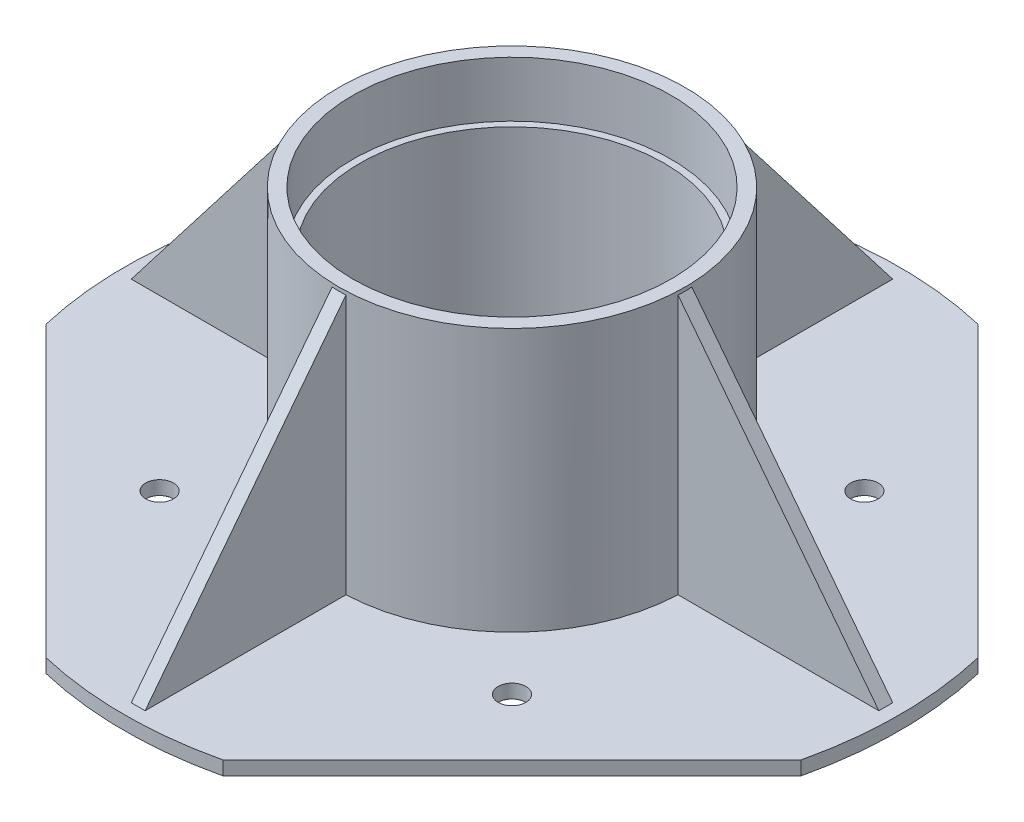
ISO-10303-21;
HEADER;
FILE_DESCRIPTION(('STEP AP214'),'2;1');
FILE_NAME('part.step','',(''),(''),'','','');
FILE_SCHEMA(('AUTOMOTIVE_DESIGN { 1 0 10303 214 1 1 1 1 }'));
ENDSEC;
DATA;
#1=APPLICATION_CONTEXT('core data for automotive mechanical design processes');
#2=APPLICATION_PROTOCOL_DEFINITION('international standard','automotive_design',2000,#1);
#3=PRODUCT_CONTEXT('',#1,'mechanical');
#4=PRODUCT('Part','Part','',(#3));
#5=PRODUCT_RELATED_PRODUCT_CATEGORY('part','',(#4));
#6=PRODUCT_DEFINITION_FORMATION('','',#4);
#7=PRODUCT_DEFINITION_CONTEXT('part definition',#1,'design');
#8=PRODUCT_DEFINITION('design','',#6,#7);
#9=PRODUCT_DEFINITION_SHAPE('','',#8);
#10=(LENGTH_UNIT() NAMED_UNIT(*) SI_UNIT(.MILLI.,.METRE.));
#11=(NAMED_UNIT(*) PLANE_ANGLE_UNIT() SI_UNIT($,.RADIAN.));
#12=(NAMED_UNIT(*) SI_UNIT($,.STERADIAN.) SOLID_ANGLE_UNIT());
#13=UNCERTAINTY_MEASURE_WITH_UNIT(LENGTH_MEASURE(1.E-05),#10,'distance_accuracy_value','');
#14=(GEOMETRIC_REPRESENTATION_CONTEXT(3) GLOBAL_UNCERTAINTY_ASSIGNED_CONTEXT((#13)) GLOBAL_UNIT_ASSIGNED_CONTEXT((#10,
#11,#12)) REPRESENTATION_CONTEXT('',''));
#15=CARTESIAN_POINT('',(0.,0.,0.));
#16=DIRECTION('',(0.,0.,1.));
#17=DIRECTION('',(1.,0.,0.));
#18=AXIS2_PLACEMENT_3D('',#15,#16,#17);
#19=CARTESIAN_POINT('',(0.,0.,0.));
#20=DIRECTION('',(0.,1.,0.));
#21=DIRECTION('',(0.,0.,1.));
#22=AXIS2_PLACEMENT_3D('',#19,#20,#21);
#23=PLANE('',#22);
#24=CARTESIAN_POINT('',(0.,0.,0.));
#25=DIRECTION('',(0.,1.,0.));
#26=DIRECTION('',(0.,0.,1.));
#27=AXIS2_PLACEMENT_3D('',#24,#25,#26);
#28=CIRCLE('',#27,57.5);
#29=CARTESIAN_POINT('',(0.,0.,57.5));
#30=VERTEX_POINT('',#29);
#31=EDGE_CURVE('E602',#30,#30,#28,.T.);
#32=ORIENTED_EDGE('',*,*,#31,.T.);
#33=EDGE_LOOP('',(#32));
#34=FACE_BOUND('',#33,.T.);
#35=DIRECTION('',(0.707106781186547,0.,-0.707106781186549));
#36=VECTOR('',#35,1.);
#37=CARTESIAN_POINT('',(84.1457069611992,0.,84.145706961199));
#38=LINE('',#37,#36);
#39=CARTESIAN_POINT('',(31.9968814710695,0.,136.294532451329));
#40=VERTEX_POINT('',#39);
#41=CARTESIAN_POINT('',(136.294532451329,0.,31.996881471069));
#42=VERTEX_POINT('',#41);
#43=EDGE_CURVE('E326',#40,#42,#38,.T.);
#44=ORIENTED_EDGE('',*,*,#43,.F.);
#45=CARTESIAN_POINT('',(0.,0.,0.));
#46=DIRECTION('',(0.,1.,0.));
#47=DIRECTION('',(0.,0.,1.));
#48=AXIS2_PLACEMENT_3D('',#45,#46,#47);
#49=CIRCLE('',#48,140.);
#50=CARTESIAN_POINT('',(-31.9968814710694,0.,136.294532451329));
#51=VERTEX_POINT('',#50);
#52=EDGE_CURVE('E610',#51,#40,#49,.T.);
#53=ORIENTED_EDGE('',*,*,#52,.F.);
#54=DIRECTION('',(-0.707106781186548,0.,-0.707106781186547));
#55=VECTOR('',#54,1.);
#56=CARTESIAN_POINT('',(-84.1457069611991,0.,84.1457069611992));
#57=LINE('',#56,#55);
#58=CARTESIAN_POINT('',(-136.294532451329,0.,31.9968814710694));
#59=VERTEX_POINT('',#58);
#60=EDGE_CURVE('E343',#51,#59,#57,.T.);
#61=ORIENTED_EDGE('',*,*,#60,.T.);
#62=CARTESIAN_POINT('',(-136.294532451329,0.,-31.9968814710694));
#63=VERTEX_POINT('',#62);
#64=EDGE_CURVE('E614',#63,#59,#49,.T.);
#65=ORIENTED_EDGE('',*,*,#64,.F.);
#66=DIRECTION('',(0.707106781186546,0.,-0.707106781186549));
#67=VECTOR('',#66,1.);
#68=CARTESIAN_POINT('',(-84.1457069611994,0.,-84.1457069611991));
#69=LINE('',#68,#67);
#70=CARTESIAN_POINT('',(-31.9968814710699,0.,-136.294532451329));
#71=VERTEX_POINT('',#70);
#72=EDGE_CURVE('E320',#63,#71,#69,.T.);
#73=ORIENTED_EDGE('',*,*,#72,.T.);
#74=CARTESIAN_POINT('',(31.9968814710675,0.,-136.294532451329));
#75=VERTEX_POINT('',#74);
#76=EDGE_CURVE('E619',#75,#71,#49,.T.);
#77=ORIENTED_EDGE('',*,*,#76,.F.);
#78=DIRECTION('',(-0.707106781186551,0.,-0.707106781186544));
#79=VECTOR('',#78,1.);
#80=CARTESIAN_POINT('',(84.1457069611982,0.,-84.1457069611992));
#81=LINE('',#80,#79);
#82=CARTESIAN_POINT('',(136.294532451329,0.,-31.996881471069));
#83=VERTEX_POINT('',#82);
#84=EDGE_CURVE('E337',#83,#75,#81,.T.);
#85=ORIENTED_EDGE('',*,*,#84,.F.);
#86=EDGE_CURVE('E561',#42,#83,#49,.T.);
#87=ORIENTED_EDGE('',*,*,#86,.F.);
#88=EDGE_LOOP('',(#44,#53,#61,#65,#73,#77,#85,#87));
#89=FACE_BOUND('',#88,.T.);
#90=CARTESIAN_POINT('',(-63.6394619107193,0.,63.6397587025132));
#91=DIRECTION('',(0.,-1.,0.));
#92=DIRECTION('',(0.,0.,-1.));
#93=AXIS2_PLACEMENT_3D('',#90,#91,#92);
#94=CIRCLE('',#93,5.025);
#95=CARTESIAN_POINT('',(-63.6394619107193,0.,58.6147587025132));
#96=VERTEX_POINT('',#95);
#97=EDGE_CURVE('E529',#96,#96,#94,.T.);
#98=ORIENTED_EDGE('',*,*,#97,.F.);
#99=EDGE_LOOP('',(#98));
#100=FACE_BOUND('',#99,.T.);
#101=CARTESIAN_POINT('',(63.6394619107194,0.,63.6397587025132));
#102=DIRECTION('',(0.,-1.,0.));
#103=DIRECTION('',(0.,0.,-1.));
#104=AXIS2_PLACEMENT_3D('',#101,#102,#103);
#105=CIRCLE('',#104,5.025);
#106=CARTESIAN_POINT('',(63.6394619107194,0.,58.6147587025132));
#107=VERTEX_POINT('',#106);
#108=EDGE_CURVE('E534',#107,#107,#105,.T.);
#109=ORIENTED_EDGE('',*,*,#108,.F.);
#110=EDGE_LOOP('',(#109));
#111=FACE_BOUND('',#110,.T.);
#112=CARTESIAN_POINT('',(63.6394619107193,0.,-63.6397587025132));
#113=DIRECTION('',(0.,-1.,0.));
#114=DIRECTION('',(0.,0.,-1.));
#115=AXIS2_PLACEMENT_3D('',#112,#113,#114);
#116=CIRCLE('',#115,5.025);
#117=CARTESIAN_POINT('',(63.6394619107193,0.,-68.6647587025132));
#118=VERTEX_POINT('',#117);
#119=EDGE_CURVE('E954',#118,#118,#116,.T.);
#120=ORIENTED_EDGE('',*,*,#119,.F.);
#121=EDGE_LOOP('',(#120));
#122=FACE_BOUND('',#121,.T.);
#123=CARTESIAN_POINT('',(-63.6394619107194,0.,-63.6397587025132));
#124=DIRECTION('',(0.,-1.,0.));
#125=DIRECTION('',(0.,0.,-1.));
#126=AXIS2_PLACEMENT_3D('',#123,#124,#125);
#127=CIRCLE('',#126,5.025);
#128=CARTESIAN_POINT('',(-67.1731522383052,0.,-60.0671325439673));
#129=VERTEX_POINT('',#128);
#130=CARTESIAN_POINT('',(-60.0485901312108,0.,-67.1549066173425));
#131=VERTEX_POINT('',#130);
#132=EDGE_CURVE('E382',#129,#131,#127,.T.);
#133=ORIENTED_EDGE('',*,*,#132,.F.);
#134=CARTESIAN_POINT('',(-63.5822804587966,0.,-63.5822804587966));
#135=DIRECTION('',(0.,-1.,0.));
#136=DIRECTION('',(0.,0.,-1.));
#137=AXIS2_PLACEMENT_3D('',#134,#135,#136);
#138=CIRCLE('',#137,5.025);
#139=EDGE_CURVE('E515',#131,#129,#138,.T.);
#140=ORIENTED_EDGE('',*,*,#139,.F.);
#141=EDGE_LOOP('',(#133,#140));
#142=FACE_BOUND('',#141,.T.);
#143=ADVANCED_FACE('F40',(#34,#89,#100,#111,#122,#142),#23,.F.);
#144=CARTESIAN_POINT('',(0.,5.,0.));
#145=DIRECTION('',(0.,-1.,0.));
#146=DIRECTION('',(0.,0.,-1.));
#147=AXIS2_PLACEMENT_3D('',#144,#145,#146);
#148=CYLINDRICAL_SURFACE('',#147,140.);
#149=ORIENTED_EDGE('',*,*,#76,.T.);
#150=DIRECTION('',(0.,-1.,0.));
#151=VECTOR('',#150,1.);
#152=CARTESIAN_POINT('',(-31.9968814710699,5.,-136.294532451329));
#153=LINE('',#152,#151);
#154=CARTESIAN_POINT('',(-31.9968814710699,5.,-136.294532451329));
#155=VERTEX_POINT('',#154);
#156=EDGE_CURVE('E347',#155,#71,#153,.T.);
#157=ORIENTED_EDGE('',*,*,#156,.F.);
#158=CARTESIAN_POINT('',(0.,5.,0.));
#159=DIRECTION('',(0.,1.,0.));
#160=DIRECTION('',(0.,0.,1.));
#161=AXIS2_PLACEMENT_3D('',#158,#159,#160);
#162=CIRCLE('',#161,140.);
#163=CARTESIAN_POINT('',(31.9968814710675,5.,-136.294532451329));
#164=VERTEX_POINT('',#163);
#165=EDGE_CURVE('E539',#164,#155,#162,.T.);
#166=ORIENTED_EDGE('',*,*,#165,.F.);
#167=DIRECTION('',(0.,-1.,0.));
#168=VECTOR('',#167,1.);
#169=CARTESIAN_POINT('',(31.9968814710675,5.,-136.294532451329));
#170=LINE('',#169,#168);
#171=EDGE_CURVE('E378',#164,#75,#170,.T.);
#172=ORIENTED_EDGE('',*,*,#171,.T.);
#173=EDGE_LOOP('',(#149,#157,#166,#172));
#174=FACE_BOUND('',#173,.T.);
#175=ADVANCED_FACE('F42',(#174),#148,.T.);
#176=DIRECTION('',(0.,-1.,0.));
#177=VECTOR('',#176,1.);
#178=CARTESIAN_POINT('',(-136.294532451329,5.,31.9968814710694));
#179=LINE('',#178,#177);
#180=CARTESIAN_POINT('',(-136.294532451329,5.,31.9968814710694));
#181=VERTEX_POINT('',#180);
#182=EDGE_CURVE('E329',#181,#59,#179,.T.);
#183=ORIENTED_EDGE('',*,*,#182,.F.);
#184=CARTESIAN_POINT('',(-136.294532451329,5.,-31.9968814710695));
#185=VERTEX_POINT('',#184);
#186=EDGE_CURVE('E546',#185,#181,#162,.T.);
#187=ORIENTED_EDGE('',*,*,#186,.F.);
#188=DIRECTION('',(0.,-1.,0.));
#189=VECTOR('',#188,1.);
#190=CARTESIAN_POINT('',(-136.294532451329,5.,-31.9968814710694));
#191=LINE('',#190,#189);
#192=EDGE_CURVE('E358',#185,#63,#191,.T.);
#193=ORIENTED_EDGE('',*,*,#192,.T.);
#194=ORIENTED_EDGE('',*,*,#64,.T.);
#195=EDGE_LOOP('',(#183,#187,#193,#194));
#196=FACE_BOUND('',#195,.T.);
#197=ADVANCED_FACE('F458',(#196),#148,.T.);
#198=DIRECTION('',(0.,-1.,0.));
#199=VECTOR('',#198,1.);
#200=CARTESIAN_POINT('',(31.9968814710695,5.,136.294532451329));
#201=LINE('',#200,#199);
#202=CARTESIAN_POINT('',(31.9968814710695,5.,136.294532451329));
#203=VERTEX_POINT('',#202);
#204=EDGE_CURVE('E333',#203,#40,#201,.T.);
#205=ORIENTED_EDGE('',*,*,#204,.F.);
#206=CARTESIAN_POINT('',(-31.9968814710695,5.,136.294532451329));
#207=VERTEX_POINT('',#206);
#208=EDGE_CURVE('E541',#207,#203,#162,.T.);
#209=ORIENTED_EDGE('',*,*,#208,.F.);
#210=DIRECTION('',(0.,-1.,0.));
#211=VECTOR('',#210,1.);
#212=CARTESIAN_POINT('',(-31.9968814710694,5.,136.294532451329));
#213=LINE('',#212,#211);
#214=EDGE_CURVE('E342',#207,#51,#213,.T.);
#215=ORIENTED_EDGE('',*,*,#214,.T.);
#216=ORIENTED_EDGE('',*,*,#52,.T.);
#217=EDGE_LOOP('',(#205,#209,#215,#216));
#218=FACE_BOUND('',#217,.T.);
#219=ADVANCED_FACE('F640',(#218),#148,.T.);
#220=ORIENTED_EDGE('',*,*,#86,.T.);
#221=DIRECTION('',(0.,-1.,0.));
#222=VECTOR('',#221,1.);
#223=CARTESIAN_POINT('',(136.294532451329,5.,-31.996881471069));
#224=LINE('',#223,#222);
#225=CARTESIAN_POINT('',(136.294532451329,5.,-31.996881471069));
#226=VERTEX_POINT('',#225);
#227=EDGE_CURVE('E372',#226,#83,#224,.T.);
#228=ORIENTED_EDGE('',*,*,#227,.F.);
#229=CARTESIAN_POINT('',(136.294532451329,5.,31.996881471069));
#230=VERTEX_POINT('',#229);
#231=EDGE_CURVE('E537',#230,#226,#162,.T.);
#232=ORIENTED_EDGE('',*,*,#231,.F.);
#233=DIRECTION('',(0.,-1.,0.));
#234=VECTOR('',#233,1.);
#235=CARTESIAN_POINT('',(136.294532451329,5.,31.996881471069));
#236=LINE('',#235,#234);
#237=EDGE_CURVE('E325',#230,#42,#236,.T.);
#238=ORIENTED_EDGE('',*,*,#237,.T.);
#239=EDGE_LOOP('',(#220,#228,#232,#238));
#240=FACE_BOUND('',#239,.T.);
#241=ADVANCED_FACE('F460',(#240),#148,.T.);
#242=CARTESIAN_POINT('',(0.,5.,0.));
#243=DIRECTION('',(0.,1.,0.));
#244=DIRECTION('',(0.,0.,1.));
#245=AXIS2_PLACEMENT_3D('',#242,#243,#244);
#246=PLANE('',#245);
#247=DIRECTION('',(0.,0.,-1.));
#248=VECTOR('',#247,1.);
#249=CARTESIAN_POINT('',(2.5,5.,0.));
#250=LINE('',#249,#248);
#251=CARTESIAN_POINT('',(2.5,5.,135.));
#252=VERTEX_POINT('',#251);
#253=CARTESIAN_POINT('',(2.5,5.,62.449979983984));
#254=VERTEX_POINT('',#253);
#255=EDGE_CURVE('E247',#252,#254,#250,.T.);
#256=ORIENTED_EDGE('',*,*,#255,.F.);
#257=DIRECTION('',(1.,0.,0.));
#258=VECTOR('',#257,1.);
#259=CARTESIAN_POINT('',(0.,5.,135.));
#260=LINE('',#259,#258);
#261=CARTESIAN_POINT('',(-2.5,5.,135.));
#262=VERTEX_POINT('',#261);
#263=EDGE_CURVE('E256',#262,#252,#260,.T.);
#264=ORIENTED_EDGE('',*,*,#263,.F.);
#265=DIRECTION('',(0.,0.,-1.));
#266=VECTOR('',#265,1.);
#267=CARTESIAN_POINT('',(-2.5,5.,0.));
#268=LINE('',#267,#266);
#269=CARTESIAN_POINT('',(-2.5,5.,62.449979983984));
#270=VERTEX_POINT('',#269);
#271=EDGE_CURVE('E239',#262,#270,#268,.T.);
#272=ORIENTED_EDGE('',*,*,#271,.T.);
#273=CARTESIAN_POINT('',(0.,5.,0.));
#274=DIRECTION('',(0.,1.,0.));
#275=DIRECTION('',(0.,0.,1.));
#276=AXIS2_PLACEMENT_3D('',#273,#274,#275);
#277=CIRCLE('',#276,62.5);
#278=CARTESIAN_POINT('',(-62.449979983984,5.,2.5));
#279=VERTEX_POINT('',#278);
#280=EDGE_CURVE('E549',#279,#270,#277,.T.);
#281=ORIENTED_EDGE('',*,*,#280,.F.);
#282=DIRECTION('',(1.,0.,0.));
#283=VECTOR('',#282,1.);
#284=CARTESIAN_POINT('',(0.,5.,2.5));
#285=LINE('',#284,#283);
#286=CARTESIAN_POINT('',(-135.,5.,2.5));
#287=VERTEX_POINT('',#286);
#288=EDGE_CURVE('E306',#287,#279,#285,.T.);
#289=ORIENTED_EDGE('',*,*,#288,.F.);
#290=DIRECTION('',(0.,0.,1.));
#291=VECTOR('',#290,1.);
#292=CARTESIAN_POINT('',(-135.,5.,0.));
#293=LINE('',#292,#291);
#294=CARTESIAN_POINT('',(-135.,5.,-2.5));
#295=VERTEX_POINT('',#294);
#296=EDGE_CURVE('E316',#295,#287,#293,.T.);
#297=ORIENTED_EDGE('',*,*,#296,.F.);
#298=DIRECTION('',(1.,0.,0.));
#299=VECTOR('',#298,1.);
#300=CARTESIAN_POINT('',(0.,5.,-2.5));
#301=LINE('',#300,#299);
#302=CARTESIAN_POINT('',(-62.449979983984,5.,-2.5));
#303=VERTEX_POINT('',#302);
#304=EDGE_CURVE('E298',#295,#303,#301,.T.);
#305=ORIENTED_EDGE('',*,*,#304,.T.);
#306=CARTESIAN_POINT('',(-2.5,5.,-62.449979983984));
#307=VERTEX_POINT('',#306);
#308=EDGE_CURVE('E556',#307,#303,#277,.T.);
#309=ORIENTED_EDGE('',*,*,#308,.F.);
#310=DIRECTION('',(0.,0.,-1.));
#311=VECTOR('',#310,1.);
#312=CARTESIAN_POINT('',(-2.5,5.,0.));
#313=LINE('',#312,#311);
#314=CARTESIAN_POINT('',(-2.5,5.,-135.));
#315=VERTEX_POINT('',#314);
#316=EDGE_CURVE('E61',#307,#315,#313,.T.);
#317=ORIENTED_EDGE('',*,*,#316,.T.);
#318=DIRECTION('',(1.,0.,0.));
#319=VECTOR('',#318,1.);
#320=CARTESIAN_POINT('',(0.,5.,-135.));
#321=LINE('',#320,#319);
#322=CARTESIAN_POINT('',(2.5,5.,-135.));
#323=VERTEX_POINT('',#322);
#324=EDGE_CURVE('E56',#323,#315,#321,.F.);
#325=ORIENTED_EDGE('',*,*,#324,.F.);
#326=DIRECTION('',(0.,0.,-1.));
#327=VECTOR('',#326,1.);
#328=CARTESIAN_POINT('',(2.5,5.,0.));
#329=LINE('',#328,#327);
#330=CARTESIAN_POINT('',(2.5,5.,-62.449979983984));
#331=VERTEX_POINT('',#330);
#332=EDGE_CURVE('E207',#331,#323,#329,.T.);
#333=ORIENTED_EDGE('',*,*,#332,.F.);
#334=CARTESIAN_POINT('',(62.449979983984,5.,-2.5));
#335=VERTEX_POINT('',#334);
#336=EDGE_CURVE('E557',#335,#331,#277,.T.);
#337=ORIENTED_EDGE('',*,*,#336,.F.);
#338=DIRECTION('',(1.,0.,0.));
#339=VECTOR('',#338,1.);
#340=CARTESIAN_POINT('',(0.,5.,-2.5));
#341=LINE('',#340,#339);
#342=CARTESIAN_POINT('',(135.,5.,-2.5));
#343=VERTEX_POINT('',#342);
#344=EDGE_CURVE('E269',#335,#343,#341,.T.);
#345=ORIENTED_EDGE('',*,*,#344,.T.);
#346=DIRECTION('',(0.,0.,1.));
#347=VECTOR('',#346,1.);
#348=CARTESIAN_POINT('',(135.,5.,0.));
#349=LINE('',#348,#347);
#350=CARTESIAN_POINT('',(135.,5.,2.5));
#351=VERTEX_POINT('',#350);
#352=EDGE_CURVE('E285',#351,#343,#349,.F.);
#353=ORIENTED_EDGE('',*,*,#352,.F.);
#354=DIRECTION('',(1.,0.,0.));
#355=VECTOR('',#354,1.);
#356=CARTESIAN_POINT('',(0.,5.,2.5));
#357=LINE('',#356,#355);
#358=CARTESIAN_POINT('',(62.449979983984,5.,2.5));
#359=VERTEX_POINT('',#358);
#360=EDGE_CURVE('E276',#359,#351,#357,.T.);
#361=ORIENTED_EDGE('',*,*,#360,.F.);
#362=EDGE_CURVE('E555',#254,#359,#277,.T.);
#363=ORIENTED_EDGE('',*,*,#362,.F.);
#364=EDGE_LOOP('',(#256,#264,#272,#281,#289,#297,#305,#309,#317,#325,#333,#337,#345,#353,#361,#363));
#365=FACE_BOUND('',#364,.T.);
#366=ORIENTED_EDGE('',*,*,#208,.T.);
#367=DIRECTION('',(0.707106781186547,0.,-0.707106781186549));
#368=VECTOR('',#367,1.);
#369=CARTESIAN_POINT('',(84.1457069611992,5.,84.145706961199));
#370=LINE('',#369,#368);
#371=EDGE_CURVE('E321',#203,#230,#370,.T.);
#372=ORIENTED_EDGE('',*,*,#371,.T.);
#373=ORIENTED_EDGE('',*,*,#231,.T.);
#374=DIRECTION('',(-0.707106781186551,0.,-0.707106781186544));
#375=VECTOR('',#374,1.);
#376=CARTESIAN_POINT('',(84.1457069611982,5.,-84.1457069611992));
#377=LINE('',#376,#375);
#378=EDGE_CURVE('E368',#226,#164,#377,.T.);
#379=ORIENTED_EDGE('',*,*,#378,.T.);
#380=ORIENTED_EDGE('',*,*,#165,.T.);
#381=DIRECTION('',(0.707106781186546,0.,-0.707106781186549));
#382=VECTOR('',#381,1.);
#383=CARTESIAN_POINT('',(-84.1457069611994,5.,-84.1457069611991));
#384=LINE('',#383,#382);
#385=EDGE_CURVE('E354',#185,#155,#384,.T.);
#386=ORIENTED_EDGE('',*,*,#385,.F.);
#387=ORIENTED_EDGE('',*,*,#186,.T.);
#388=DIRECTION('',(-0.707106781186548,0.,-0.707106781186547));
#389=VECTOR('',#388,1.);
#390=CARTESIAN_POINT('',(-84.1457069611991,5.,84.1457069611992));
#391=LINE('',#390,#389);
#392=EDGE_CURVE('E338',#207,#181,#391,.T.);
#393=ORIENTED_EDGE('',*,*,#392,.F.);
#394=EDGE_LOOP('',(#366,#372,#373,#379,#380,#386,#387,#393));
#395=FACE_BOUND('',#394,.T.);
#396=CARTESIAN_POINT('',(-63.6394619107194,5.,-63.6397587025132));
#397=DIRECTION('',(0.,1.,0.));
#398=DIRECTION('',(0.,0.,1.));
#399=AXIS2_PLACEMENT_3D('',#396,#397,#398);
#400=CIRCLE('',#399,4.99999999999999);
#401=CARTESIAN_POINT('',(-60.0663140789197,5.,-67.1372741881265));
#402=VERTEX_POINT('',#401);
#403=CARTESIAN_POINT('',(-67.1554282905963,5.,-60.0847649731833));
#404=VERTEX_POINT('',#403);
#405=EDGE_CURVE('E569',#402,#404,#400,.T.);
#406=ORIENTED_EDGE('',*,*,#405,.F.);
#407=CARTESIAN_POINT('',(-63.5822804587966,5.,-63.5822804587966));
#408=DIRECTION('',(0.,1.,0.));
#409=DIRECTION('',(0.,0.,1.));
#410=AXIS2_PLACEMENT_3D('',#407,#408,#409);
#411=CIRCLE('',#410,4.99999999999999);
#412=EDGE_CURVE('E500',#404,#402,#411,.T.);
#413=ORIENTED_EDGE('',*,*,#412,.F.);
#414=EDGE_LOOP('',(#406,#413));
#415=FACE_BOUND('',#414,.T.);
#416=CARTESIAN_POINT('',(63.6394619107193,5.,-63.6397587025132));
#417=DIRECTION('',(0.,1.,0.));
#418=DIRECTION('',(0.,0.,1.));
#419=AXIS2_PLACEMENT_3D('',#416,#417,#418);
#420=CIRCLE('',#419,5.);
#421=CARTESIAN_POINT('',(63.6394619107193,5.,-58.6397587025132));
#422=VERTEX_POINT('',#421);
#423=EDGE_CURVE('E531',#422,#422,#420,.T.);
#424=ORIENTED_EDGE('',*,*,#423,.F.);
#425=EDGE_LOOP('',(#424));
#426=FACE_BOUND('',#425,.T.);
#427=CARTESIAN_POINT('',(63.6394619107194,5.,63.6397587025132));
#428=DIRECTION('',(0.,1.,0.));
#429=DIRECTION('',(0.,0.,1.));
#430=AXIS2_PLACEMENT_3D('',#427,#428,#429);
#431=CIRCLE('',#430,5.);
#432=CARTESIAN_POINT('',(63.6394619107194,5.,68.6397587025131));
#433=VERTEX_POINT('',#432);
#434=EDGE_CURVE('E525',#433,#433,#431,.T.);
#435=ORIENTED_EDGE('',*,*,#434,.F.);
#436=EDGE_LOOP('',(#435));
#437=FACE_BOUND('',#436,.T.);
#438=CARTESIAN_POINT('',(-63.6394619107193,5.,63.6397587025132));
#439=DIRECTION('',(0.,1.,0.));
#440=DIRECTION('',(0.,0.,1.));
#441=AXIS2_PLACEMENT_3D('',#438,#439,#440);
#442=CIRCLE('',#441,4.99999999999999);
#443=CARTESIAN_POINT('',(-63.6394619107193,5.,68.6397587025132));
#444=VERTEX_POINT('',#443);
#445=EDGE_CURVE('E521',#444,#444,#442,.T.);
#446=ORIENTED_EDGE('',*,*,#445,.F.);
#447=EDGE_LOOP('',(#446));
#448=FACE_BOUND('',#447,.T.);
#449=ADVANCED_FACE('F464',(#365,#395,#415,#426,#437,#448),#246,.T.);
#450=CARTESIAN_POINT('',(0.,100.,0.));
#451=DIRECTION('',(0.,-1.,0.));
#452=DIRECTION('',(0.,0.,-1.));
#453=AXIS2_PLACEMENT_3D('',#450,#451,#452);
#454=CYLINDRICAL_SURFACE('',#453,55.);
#455=CARTESIAN_POINT('',(0.,20.,0.));
#456=DIRECTION('',(0.,1.,0.));
#457=DIRECTION('',(0.,0.,1.));
#458=AXIS2_PLACEMENT_3D('',#455,#456,#457);
#459=CIRCLE('',#458,55.);
#460=CARTESIAN_POINT('',(0.,20.,55.));
#461=VERTEX_POINT('',#460);
#462=EDGE_CURVE('E597',#461,#461,#459,.T.);
#463=ORIENTED_EDGE('',*,*,#462,.F.);
#464=EDGE_LOOP('',(#463));
#465=FACE_BOUND('',#464,.T.);
#466=CARTESIAN_POINT('',(0.,80.,0.));
#467=DIRECTION('',(0.,1.,0.));
#468=DIRECTION('',(0.,0.,1.));
#469=AXIS2_PLACEMENT_3D('',#466,#467,#468);
#470=CIRCLE('',#469,55.);
#471=CARTESIAN_POINT('',(0.,80.,55.));
#472=VERTEX_POINT('',#471);
#473=EDGE_CURVE('E519',#472,#472,#470,.T.);
#474=ORIENTED_EDGE('',*,*,#473,.T.);
#475=EDGE_LOOP('',(#474));
#476=FACE_BOUND('',#475,.T.);
#477=ADVANCED_FACE('F467',(#465,#476),#454,.F.);
#478=CARTESIAN_POINT('',(0.,100.,0.));
#479=DIRECTION('',(0.,-1.,0.));
#480=DIRECTION('',(0.,0.,-1.));
#481=AXIS2_PLACEMENT_3D('',#478,#479,#480);
#482=CYLINDRICAL_SURFACE('',#481,62.5);
#483=CARTESIAN_POINT('',(0.,179.489795918367,0.));
#484=DIRECTION('',(0.,0.611921285632742,0.790918668504905));
#485=DIRECTION('',(0.,-0.790918668504905,0.611921285632742));
#486=AXIS2_PLACEMENT_3D('',#483,#484,#485);
#487=ELLIPSE('',#486,102.137319729568,62.5);
#488=CARTESIAN_POINT('',(-2.5,98.7721347145785,62.449979983984));
#489=VERTEX_POINT('',#488);
#490=CARTESIAN_POINT('',(2.5,98.7721347145785,62.449979983984));
#491=VERTEX_POINT('',#490);
#492=EDGE_CURVE('E251',#489,#491,#487,.T.);
#493=ORIENTED_EDGE('',*,*,#492,.T.);
#494=DIRECTION('',(0.,-1.,0.));
#495=VECTOR('',#494,1.);
#496=CARTESIAN_POINT('',(2.5,100.,62.449979983984));
#497=LINE('',#496,#495);
#498=EDGE_CURVE('E243',#491,#254,#497,.T.);
#499=ORIENTED_EDGE('',*,*,#498,.T.);
#500=ORIENTED_EDGE('',*,*,#362,.T.);
#501=DIRECTION('',(0.,-1.,0.));
#502=VECTOR('',#501,1.);
#503=CARTESIAN_POINT('',(62.449979983984,100.,2.5));
#504=LINE('',#503,#502);
#505=CARTESIAN_POINT('',(62.449979983984,98.7721347145785,2.5));
#506=VERTEX_POINT('',#505);
#507=EDGE_CURVE('E272',#359,#506,#504,.F.);
#508=ORIENTED_EDGE('',*,*,#507,.T.);
#509=CARTESIAN_POINT('',(0.,179.489795918367,0.));
#510=DIRECTION('',(-0.790918668504905,-0.611921285632743,0.));
#511=DIRECTION('',(0.611921285632743,-0.790918668504905,0.));
#512=AXIS2_PLACEMENT_3D('',#509,#510,#511);
#513=ELLIPSE('',#512,102.137319729568,62.5);
#514=CARTESIAN_POINT('',(62.449979983984,98.7721347145785,-2.5));
#515=VERTEX_POINT('',#514);
#516=EDGE_CURVE('E280',#506,#515,#513,.F.);
#517=ORIENTED_EDGE('',*,*,#516,.T.);
#518=DIRECTION('',(0.,-1.,0.));
#519=VECTOR('',#518,1.);
#520=CARTESIAN_POINT('',(62.449979983984,100.,-2.5));
#521=LINE('',#520,#519);
#522=EDGE_CURVE('E265',#335,#515,#521,.F.);
#523=ORIENTED_EDGE('',*,*,#522,.F.);
#524=ORIENTED_EDGE('',*,*,#336,.T.);
#525=DIRECTION('',(0.,-1.,0.));
#526=VECTOR('',#525,1.);
#527=CARTESIAN_POINT('',(2.5,100.,-62.449979983984));
#528=LINE('',#527,#526);
#529=CARTESIAN_POINT('',(2.5,98.7721347145785,-62.449979983984));
#530=VERTEX_POINT('',#529);
#531=EDGE_CURVE('E201',#331,#530,#528,.F.);
#532=ORIENTED_EDGE('',*,*,#531,.T.);
#533=CARTESIAN_POINT('',(0.,179.489795918367,0.));
#534=DIRECTION('',(0.,-0.611921285632742,0.790918668504905));
#535=DIRECTION('',(0.,-0.790918668504905,-0.611921285632742));
#536=AXIS2_PLACEMENT_3D('',#533,#534,#535);
#537=ELLIPSE('',#536,102.137319729568,62.5);
#538=CARTESIAN_POINT('',(-2.5,98.7721347145785,-62.449979983984));
#539=VERTEX_POINT('',#538);
#540=EDGE_CURVE('E194',#530,#539,#537,.F.);
#541=ORIENTED_EDGE('',*,*,#540,.T.);
#542=DIRECTION('',(0.,-1.,0.));
#543=VECTOR('',#542,1.);
#544=CARTESIAN_POINT('',(-2.5,100.,-62.449979983984));
#545=LINE('',#544,#543);
#546=EDGE_CURVE('E198',#307,#539,#545,.F.);
#547=ORIENTED_EDGE('',*,*,#546,.F.);
#548=ORIENTED_EDGE('',*,*,#308,.T.);
#549=DIRECTION('',(0.,-1.,0.));
#550=VECTOR('',#549,1.);
#551=CARTESIAN_POINT('',(-62.449979983984,100.,-2.5));
#552=LINE('',#551,#550);
#553=CARTESIAN_POINT('',(-62.449979983984,98.7721347145785,-2.5));
#554=VERTEX_POINT('',#553);
#555=EDGE_CURVE('E294',#554,#303,#552,.T.);
#556=ORIENTED_EDGE('',*,*,#555,.F.);
#557=CARTESIAN_POINT('',(0.,179.489795918367,0.));
#558=DIRECTION('',(-0.790918668504905,0.611921285632742,0.));
#559=DIRECTION('',(-0.611921285632742,-0.790918668504905,0.));
#560=AXIS2_PLACEMENT_3D('',#557,#558,#559);
#561=ELLIPSE('',#560,102.137319729568,62.5);
#562=CARTESIAN_POINT('',(-62.4499799839839,98.7721347145786,2.5));
#563=VERTEX_POINT('',#562);
#564=EDGE_CURVE('E310',#554,#563,#561,.T.);
#565=ORIENTED_EDGE('',*,*,#564,.T.);
#566=DIRECTION('',(0.,-1.,0.));
#567=VECTOR('',#566,1.);
#568=CARTESIAN_POINT('',(-62.449979983984,100.,2.5));
#569=LINE('',#568,#567);
#570=EDGE_CURVE('E302',#563,#279,#569,.T.);
#571=ORIENTED_EDGE('',*,*,#570,.T.);
#572=ORIENTED_EDGE('',*,*,#280,.T.);
#573=DIRECTION('',(0.,-1.,0.));
#574=VECTOR('',#573,1.);
#575=CARTESIAN_POINT('',(-2.5,100.,62.449979983984));
#576=LINE('',#575,#574);
#577=EDGE_CURVE('E235',#489,#270,#576,.T.);
#578=ORIENTED_EDGE('',*,*,#577,.F.);
#579=EDGE_LOOP('',(#493,#499,#500,#508,#517,#523,#524,#532,#541,#547,#548,#556,#565,#571,#572,#578));
#580=FACE_BOUND('',#579,.T.);
#581=CARTESIAN_POINT('',(0.,100.,0.));
#582=DIRECTION('',(0.,1.,0.));
#583=DIRECTION('',(0.,0.,1.));
#584=AXIS2_PLACEMENT_3D('',#581,#582,#583);
#585=CIRCLE('',#584,62.5);
#586=CARTESIAN_POINT('',(0.,100.,62.5));
#587=VERTEX_POINT('',#586);
#588=EDGE_CURVE('E606',#587,#587,#585,.T.);
#589=ORIENTED_EDGE('',*,*,#588,.F.);
#590=EDGE_LOOP('',(#589));
#591=FACE_BOUND('',#590,.T.);
#592=ADVANCED_FACE('F196',(#580,#591),#482,.T.);
#593=CARTESIAN_POINT('',(0.,100.,0.));
#594=DIRECTION('',(0.,1.,0.));
#595=DIRECTION('',(0.,0.,1.));
#596=AXIS2_PLACEMENT_3D('',#593,#594,#595);
#597=PLANE('',#596);
#598=CARTESIAN_POINT('',(0.,100.,0.));
#599=DIRECTION('',(0.,1.,0.));
#600=DIRECTION('',(0.,0.,1.));
#601=AXIS2_PLACEMENT_3D('',#598,#599,#600);
#602=CIRCLE('',#601,57.5);
#603=CARTESIAN_POINT('',(0.,100.,57.5));
#604=VERTEX_POINT('',#603);
#605=EDGE_CURVE('E507',#604,#604,#602,.T.);
#606=ORIENTED_EDGE('',*,*,#605,.F.);
#607=EDGE_LOOP('',(#606));
#608=FACE_BOUND('',#607,.T.);
#609=ORIENTED_EDGE('',*,*,#588,.T.);
#610=EDGE_LOOP('',(#609));
#611=FACE_BOUND('',#610,.T.);
#612=ADVANCED_FACE('F470',(#608,#611),#597,.T.);
#613=CARTESIAN_POINT('',(0.,20.,0.));
#614=DIRECTION('',(0.,-1.,0.));
#615=DIRECTION('',(0.,0.,-1.));
#616=AXIS2_PLACEMENT_3D('',#613,#614,#615);
#617=CYLINDRICAL_SURFACE('',#616,57.5);
#618=ORIENTED_EDGE('',*,*,#31,.F.);
#619=EDGE_LOOP('',(#618));
#620=FACE_BOUND('',#619,.T.);
#621=CARTESIAN_POINT('',(0.,20.,0.));
#622=DIRECTION('',(0.,1.,0.));
#623=DIRECTION('',(0.,0.,1.));
#624=AXIS2_PLACEMENT_3D('',#621,#622,#623);
#625=CIRCLE('',#624,57.5);
#626=CARTESIAN_POINT('',(0.,20.,57.5));
#627=VERTEX_POINT('',#626);
#628=EDGE_CURVE('E601',#627,#627,#625,.T.);
#629=ORIENTED_EDGE('',*,*,#628,.T.);
#630=EDGE_LOOP('',(#629));
#631=FACE_BOUND('',#630,.T.);
#632=ADVANCED_FACE('F476',(#620,#631),#617,.F.);
#633=CARTESIAN_POINT('',(0.,20.,0.));
#634=DIRECTION('',(0.,1.,0.));
#635=DIRECTION('',(0.,0.,1.));
#636=AXIS2_PLACEMENT_3D('',#633,#634,#635);
#637=PLANE('',#636);
#638=ORIENTED_EDGE('',*,*,#462,.T.);
#639=EDGE_LOOP('',(#638));
#640=FACE_BOUND('',#639,.T.);
#641=ORIENTED_EDGE('',*,*,#628,.F.);
#642=EDGE_LOOP('',(#641));
#643=FACE_BOUND('',#642,.T.);
#644=ADVANCED_FACE('F480',(#640,#643),#637,.F.);
#645=CARTESIAN_POINT('',(0.,80.,0.));
#646=DIRECTION('',(0.,1.,0.));
#647=DIRECTION('',(0.,0.,1.));
#648=AXIS2_PLACEMENT_3D('',#645,#646,#647);
#649=CYLINDRICAL_SURFACE('',#648,57.5);
#650=CARTESIAN_POINT('',(0.,80.,0.));
#651=DIRECTION('',(0.,1.,0.));
#652=DIRECTION('',(0.,0.,1.));
#653=AXIS2_PLACEMENT_3D('',#650,#651,#652);
#654=CIRCLE('',#653,57.5);
#655=CARTESIAN_POINT('',(0.,80.,57.5));
#656=VERTEX_POINT('',#655);
#657=EDGE_CURVE('E513',#656,#656,#654,.T.);
#658=ORIENTED_EDGE('',*,*,#657,.F.);
#659=EDGE_LOOP('',(#658));
#660=FACE_BOUND('',#659,.T.);
#661=ORIENTED_EDGE('',*,*,#605,.T.);
#662=EDGE_LOOP('',(#661));
#663=FACE_BOUND('',#662,.T.);
#664=ADVANCED_FACE('F484',(#660,#663),#649,.F.);
#665=CARTESIAN_POINT('',(0.,80.,0.));
#666=DIRECTION('',(0.,1.,0.));
#667=DIRECTION('',(0.,0.,1.));
#668=AXIS2_PLACEMENT_3D('',#665,#666,#667);
#669=PLANE('',#668);
#670=ORIENTED_EDGE('',*,*,#473,.F.);
#671=EDGE_LOOP('',(#670));
#672=FACE_BOUND('',#671,.T.);
#673=ORIENTED_EDGE('',*,*,#657,.T.);
#674=EDGE_LOOP('',(#673));
#675=FACE_BOUND('',#674,.T.);
#676=ADVANCED_FACE('F488',(#672,#675),#669,.T.);
#677=CARTESIAN_POINT('',(-63.5822804587966,0.,-63.5822804587966));
#678=DIRECTION('',(0.,-1.,0.));
#679=DIRECTION('',(0.,0.,-1.));
#680=AXIS2_PLACEMENT_3D('',#677,#678,#679);
#681=CYLINDRICAL_SURFACE('',#680,4.99999999999999);
#682=ORIENTED_EDGE('',*,*,#412,.T.);
#683=DIRECTION('',(0.,-1.,0.));
#684=VECTOR('',#683,1.);
#685=CARTESIAN_POINT('',(-60.0663140789197,50.0125,-67.1372741881265));
#686=LINE('',#685,#684);
#687=CARTESIAN_POINT('',(-60.0663140789195,0.0250000000000033,-67.1372741881264));
#688=VERTEX_POINT('',#687);
#689=EDGE_CURVE('E12',#402,#688,#686,.T.);
#690=ORIENTED_EDGE('',*,*,#689,.T.);
#691=CARTESIAN_POINT('',(-63.5822804587966,0.0250000000000033,-63.5822804587966));
#692=DIRECTION('',(0.,-1.,0.));
#693=DIRECTION('',(0.,0.,-1.));
#694=AXIS2_PLACEMENT_3D('',#691,#692,#693);
#695=CIRCLE('',#694,5.);
#696=CARTESIAN_POINT('',(-67.1554282905963,0.0250000000000033,-60.0847649731832));
#697=VERTEX_POINT('',#696);
#698=EDGE_CURVE('E508',#688,#697,#695,.T.);
#699=ORIENTED_EDGE('',*,*,#698,.T.);
#700=DIRECTION('',(0.,-1.,0.));
#701=VECTOR('',#700,1.);
#702=CARTESIAN_POINT('',(-67.1554282905963,50.0125,-60.0847649731833));
#703=LINE('',#702,#701);
#704=EDGE_CURVE('E49',#697,#404,#703,.F.);
#705=ORIENTED_EDGE('',*,*,#704,.T.);
#706=EDGE_LOOP('',(#682,#690,#699,#705));
#707=FACE_BOUND('',#706,.T.);
#708=ADVANCED_FACE('F447',(#707),#681,.F.);
#709=CARTESIAN_POINT('',(-63.5822804587966,0.,-63.5822804587966));
#710=DIRECTION('',(0.,-1.,0.));
#711=DIRECTION('',(0.,0.,-1.));
#712=AXIS2_PLACEMENT_3D('',#709,#710,#711);
#713=CONICAL_SURFACE('',#712,5.025,0.785398163397466);
#714=ORIENTED_EDGE('',*,*,#698,.F.);
#715=CARTESIAN_POINT('',(-60.0664558705247,0.0252000000000036,-67.1371331286695));
#716=CARTESIAN_POINT('',(-60.0634546153793,0.0209666666666682,-67.1401188866835));
#717=CARTESIAN_POINT('',(-60.0604533602339,0.0167333333333332,-67.1431046446974));
#718=CARTESIAN_POINT('',(-60.0544508499432,0.00826666666666329,-67.1490761607253));
#719=CARTESIAN_POINT('',(-60.0514495947978,0.00403333333332832,-67.1520619187392));
#720=CARTESIAN_POINT('',(-60.0484483396524,-0.000200000000006246,-67.1550476767531));
#721=B_SPLINE_CURVE_WITH_KNOTS('',3,(#715,#716,#717,#718,#719,#720),.UNSPECIFIED.,.F.,.F.,(4,2,
4),(0.,0.017960805947654,0.0359216118953115),.UNSPECIFIED.);
#722=EDGE_CURVE('E399',#688,#131,#721,.T.);
#723=ORIENTED_EDGE('',*,*,#722,.T.);
#724=ORIENTED_EDGE('',*,*,#139,.T.);
#725=CARTESIAN_POINT('',(-67.1732940298636,-0.000199999999999836,-60.0669914845567));
#726=CARTESIAN_POINT('',(-67.1702927747182,0.00403333333333446,-60.0699772425706));
#727=CARTESIAN_POINT('',(-67.1672915195728,0.00826666666666793,-60.0729630005846));
#728=CARTESIAN_POINT('',(-67.1612890092821,0.0167333333333349,-60.0789345166124));
#729=CARTESIAN_POINT('',(-67.1582877541367,0.0209666666666684,-60.0819202746264));
#730=CARTESIAN_POINT('',(-67.1552864989913,0.025200000000001,-60.0849060326403));
#731=B_SPLINE_CURVE_WITH_KNOTS('',3,(#725,#726,#727,#728,#729,#730),.UNSPECIFIED.,.F.,.F.,(4,2,
4),(0.,0.0179608059476439,0.0359216118952947),.UNSPECIFIED.);
#732=EDGE_CURVE('E389',#129,#697,#731,.T.);
#733=ORIENTED_EDGE('',*,*,#732,.T.);
#734=EDGE_LOOP('',(#714,#723,#724,#733));
#735=FACE_BOUND('',#734,.T.);
#736=ADVANCED_FACE('F405',(#735),#713,.F.);
#737=CARTESIAN_POINT('',(-63.6394619107193,0.,63.6397587025132));
#738=DIRECTION('',(0.,-1.,0.));
#739=DIRECTION('',(0.,0.,-1.));
#740=AXIS2_PLACEMENT_3D('',#737,#738,#739);
#741=CYLINDRICAL_SURFACE('',#740,4.99999999999999);
#742=ORIENTED_EDGE('',*,*,#445,.T.);
#743=EDGE_LOOP('',(#742));
#744=FACE_BOUND('',#743,.T.);
#745=CARTESIAN_POINT('',(-63.6394619107193,0.0250000000000033,63.6397587025132));
#746=DIRECTION('',(0.,-1.,0.));
#747=DIRECTION('',(0.,0.,-1.));
#748=AXIS2_PLACEMENT_3D('',#745,#746,#747);
#749=CIRCLE('',#748,5.);
#750=CARTESIAN_POINT('',(-63.6394619107193,0.0250000000000033,58.6397587025132));
#751=VERTEX_POINT('',#750);
#752=EDGE_CURVE('E524',#751,#751,#749,.T.);
#753=ORIENTED_EDGE('',*,*,#752,.T.);
#754=EDGE_LOOP('',(#753));
#755=FACE_BOUND('',#754,.T.);
#756=ADVANCED_FACE('F440',(#744,#755),#741,.F.);
#757=CARTESIAN_POINT('',(-63.6394619107193,0.,63.6397587025132));
#758=DIRECTION('',(0.,-1.,0.));
#759=DIRECTION('',(0.,0.,-1.));
#760=AXIS2_PLACEMENT_3D('',#757,#758,#759);
#761=CONICAL_SURFACE('',#760,5.025,0.785398163397466);
#762=ORIENTED_EDGE('',*,*,#752,.F.);
#763=EDGE_LOOP('',(#762));
#764=FACE_BOUND('',#763,.T.);
#765=ORIENTED_EDGE('',*,*,#97,.T.);
#766=EDGE_LOOP('',(#765));
#767=FACE_BOUND('',#766,.T.);
#768=ADVANCED_FACE('F437',(#764,#767),#761,.F.);
#769=CARTESIAN_POINT('',(63.6394619107194,0.,63.6397587025132));
#770=DIRECTION('',(0.,-1.,0.));
#771=DIRECTION('',(0.,0.,-1.));
#772=AXIS2_PLACEMENT_3D('',#769,#770,#771);
#773=CYLINDRICAL_SURFACE('',#772,5.);
#774=ORIENTED_EDGE('',*,*,#434,.T.);
#775=EDGE_LOOP('',(#774));
#776=FACE_BOUND('',#775,.T.);
#777=CARTESIAN_POINT('',(63.6394619107194,0.0250000000000033,63.6397587025132));
#778=DIRECTION('',(0.,-1.,0.));
#779=DIRECTION('',(0.,0.,-1.));
#780=AXIS2_PLACEMENT_3D('',#777,#778,#779);
#781=CIRCLE('',#780,5.);
#782=CARTESIAN_POINT('',(63.6394619107194,0.0250000000000033,58.6397587025132));
#783=VERTEX_POINT('',#782);
#784=EDGE_CURVE('E530',#783,#783,#781,.T.);
#785=ORIENTED_EDGE('',*,*,#784,.T.);
#786=EDGE_LOOP('',(#785));
#787=FACE_BOUND('',#786,.T.);
#788=ADVANCED_FACE('F433',(#776,#787),#773,.F.);
#789=CARTESIAN_POINT('',(63.6394619107194,0.,63.6397587025132));
#790=DIRECTION('',(0.,-1.,0.));
#791=DIRECTION('',(0.,0.,-1.));
#792=AXIS2_PLACEMENT_3D('',#789,#790,#791);
#793=CONICAL_SURFACE('',#792,5.025,0.785398163397327);
#794=ORIENTED_EDGE('',*,*,#784,.F.);
#795=EDGE_LOOP('',(#794));
#796=FACE_BOUND('',#795,.T.);
#797=ORIENTED_EDGE('',*,*,#108,.T.);
#798=EDGE_LOOP('',(#797));
#799=FACE_BOUND('',#798,.T.);
#800=ADVANCED_FACE('F429',(#796,#799),#793,.F.);
#801=CARTESIAN_POINT('',(63.6394619107193,0.,-63.6397587025132));
#802=DIRECTION('',(0.,-1.,0.));
#803=DIRECTION('',(0.,0.,-1.));
#804=AXIS2_PLACEMENT_3D('',#801,#802,#803);
#805=CYLINDRICAL_SURFACE('',#804,5.);
#806=ORIENTED_EDGE('',*,*,#423,.T.);
#807=EDGE_LOOP('',(#806));
#808=FACE_BOUND('',#807,.T.);
#809=CARTESIAN_POINT('',(63.6394619107193,0.0250000000000033,-63.6397587025132));
#810=DIRECTION('',(0.,-1.,0.));
#811=DIRECTION('',(0.,0.,-1.));
#812=AXIS2_PLACEMENT_3D('',#809,#810,#811);
#813=CIRCLE('',#812,5.);
#814=CARTESIAN_POINT('',(63.6394619107193,0.0250000000000033,-68.6397587025132));
#815=VERTEX_POINT('',#814);
#816=EDGE_CURVE('E535',#815,#815,#813,.T.);
#817=ORIENTED_EDGE('',*,*,#816,.T.);
#818=EDGE_LOOP('',(#817));
#819=FACE_BOUND('',#818,.T.);
#820=ADVANCED_FACE('F425',(#808,#819),#805,.F.);
#821=CARTESIAN_POINT('',(63.6394619107193,0.,-63.6397587025132));
#822=DIRECTION('',(0.,-1.,0.));
#823=DIRECTION('',(0.,0.,-1.));
#824=AXIS2_PLACEMENT_3D('',#821,#822,#823);
#825=CONICAL_SURFACE('',#824,5.025,0.785398163397327);
#826=ORIENTED_EDGE('',*,*,#816,.F.);
#827=EDGE_LOOP('',(#826));
#828=FACE_BOUND('',#827,.T.);
#829=ORIENTED_EDGE('',*,*,#119,.T.);
#830=EDGE_LOOP('',(#829));
#831=FACE_BOUND('',#830,.T.);
#832=ADVANCED_FACE('F421',(#828,#831),#825,.F.);
#833=CARTESIAN_POINT('',(-63.6394619107194,0.,-63.6397587025132));
#834=DIRECTION('',(0.,-1.,0.));
#835=DIRECTION('',(0.,0.,-1.));
#836=AXIS2_PLACEMENT_3D('',#833,#834,#835);
#837=CYLINDRICAL_SURFACE('',#836,4.99999999999999);
#838=ORIENTED_EDGE('',*,*,#405,.T.);
#839=ORIENTED_EDGE('',*,*,#704,.F.);
#840=CARTESIAN_POINT('',(-63.6394619107194,0.0250000000000033,-63.6397587025132));
#841=DIRECTION('',(0.,-1.,0.));
#842=DIRECTION('',(0.,0.,-1.));
#843=AXIS2_PLACEMENT_3D('',#840,#841,#842);
#844=CIRCLE('',#843,5.);
#845=EDGE_CURVE('E385',#697,#688,#844,.T.);
#846=ORIENTED_EDGE('',*,*,#845,.T.);
#847=ORIENTED_EDGE('',*,*,#689,.F.);
#848=EDGE_LOOP('',(#838,#839,#846,#847));
#849=FACE_BOUND('',#848,.T.);
#850=ADVANCED_FACE('F415',(#849),#837,.F.);
#851=CARTESIAN_POINT('',(-63.6394619107194,0.,-63.6397587025132));
#852=DIRECTION('',(0.,-1.,0.));
#853=DIRECTION('',(0.,0.,-1.));
#854=AXIS2_PLACEMENT_3D('',#851,#852,#853);
#855=CONICAL_SURFACE('',#854,5.025,0.785398163397466);
#856=ORIENTED_EDGE('',*,*,#845,.F.);
#857=ORIENTED_EDGE('',*,*,#732,.F.);
#858=ORIENTED_EDGE('',*,*,#132,.T.);
#859=ORIENTED_EDGE('',*,*,#722,.F.);
#860=EDGE_LOOP('',(#856,#857,#858,#859));
#861=FACE_BOUND('',#860,.T.);
#862=ADVANCED_FACE('F409',(#861),#855,.F.);
#863=CARTESIAN_POINT('',(84.1457069611982,5.,-84.1457069611992));
#864=DIRECTION('',(-0.707106781186544,0.,0.707106781186551));
#865=DIRECTION('',(0.707106781186551,0.,0.707106781186544));
#866=AXIS2_PLACEMENT_3D('',#863,#864,#865);
#867=PLANE('',#866);
#868=ORIENTED_EDGE('',*,*,#84,.T.);
#869=ORIENTED_EDGE('',*,*,#171,.F.);
#870=ORIENTED_EDGE('',*,*,#378,.F.);
#871=ORIENTED_EDGE('',*,*,#227,.T.);
#872=EDGE_LOOP('',(#868,#869,#870,#871));
#873=FACE_BOUND('',#872,.T.);
#874=ADVANCED_FACE('F414',(#873),#867,.F.);
#875=CARTESIAN_POINT('',(84.1457069611992,5.,84.145706961199));
#876=DIRECTION('',(-0.707106781186549,0.,-0.707106781186547));
#877=DIRECTION('',(-0.707106781186547,0.,0.707106781186549));
#878=AXIS2_PLACEMENT_3D('',#875,#876,#877);
#879=PLANE('',#878);
#880=ORIENTED_EDGE('',*,*,#43,.T.);
#881=ORIENTED_EDGE('',*,*,#237,.F.);
#882=ORIENTED_EDGE('',*,*,#371,.F.);
#883=ORIENTED_EDGE('',*,*,#204,.T.);
#884=EDGE_LOOP('',(#880,#881,#882,#883));
#885=FACE_BOUND('',#884,.T.);
#886=ADVANCED_FACE('F642',(#885),#879,.F.);
#887=CARTESIAN_POINT('',(-84.1457069611991,5.,84.1457069611992));
#888=DIRECTION('',(-0.707106781186547,0.,0.707106781186548));
#889=DIRECTION('',(0.707106781186548,0.,0.707106781186547));
#890=AXIS2_PLACEMENT_3D('',#887,#888,#889);
#891=PLANE('',#890);
#892=ORIENTED_EDGE('',*,*,#60,.F.);
#893=ORIENTED_EDGE('',*,*,#214,.F.);
#894=ORIENTED_EDGE('',*,*,#392,.T.);
#895=ORIENTED_EDGE('',*,*,#182,.T.);
#896=EDGE_LOOP('',(#892,#893,#894,#895));
#897=FACE_BOUND('',#896,.T.);
#898=ADVANCED_FACE('F639',(#897),#891,.T.);
#899=CARTESIAN_POINT('',(-84.1457069611994,5.,-84.1457069611991));
#900=DIRECTION('',(-0.707106781186549,0.,-0.707106781186546));
#901=DIRECTION('',(-0.707106781186546,0.,0.707106781186549));
#902=AXIS2_PLACEMENT_3D('',#899,#900,#901);
#903=PLANE('',#902);
#904=ORIENTED_EDGE('',*,*,#72,.F.);
#905=ORIENTED_EDGE('',*,*,#192,.F.);
#906=ORIENTED_EDGE('',*,*,#385,.T.);
#907=ORIENTED_EDGE('',*,*,#156,.T.);
#908=EDGE_LOOP('',(#904,#905,#906,#907));
#909=FACE_BOUND('',#908,.T.);
#910=ADVANCED_FACE('F630',(#909),#903,.T.);
#911=CARTESIAN_POINT('',(-61.5,100.,0.));
#912=DIRECTION('',(-0.790918668504905,0.611921285632742,0.));
#913=DIRECTION('',(-0.611921285632742,-0.790918668504905,0.));
#914=AXIS2_PLACEMENT_3D('',#911,#912,#913);
#915=PLANE('',#914);
#916=DIRECTION('',(-0.611921285632742,-0.790918668504905,0.));
#917=VECTOR('',#916,1.);
#918=CARTESIAN_POINT('',(-61.5,100.,-2.5));
#919=LINE('',#918,#917);
#920=EDGE_CURVE('E289',#554,#295,#919,.T.);
#921=ORIENTED_EDGE('',*,*,#920,.T.);
#922=ORIENTED_EDGE('',*,*,#296,.T.);
#923=DIRECTION('',(-0.611921285632742,-0.790918668504905,0.));
#924=VECTOR('',#923,1.);
#925=CARTESIAN_POINT('',(-61.5,100.,2.5));
#926=LINE('',#925,#924);
#927=EDGE_CURVE('E290',#563,#287,#926,.T.);
#928=ORIENTED_EDGE('',*,*,#927,.F.);
#929=ORIENTED_EDGE('',*,*,#564,.F.);
#930=EDGE_LOOP('',(#921,#922,#928,#929));
#931=FACE_BOUND('',#930,.T.);
#932=ADVANCED_FACE('F757',(#931),#915,.T.);
#933=CARTESIAN_POINT('',(0.,50.,2.5));
#934=DIRECTION('',(0.,0.,1.));
#935=DIRECTION('',(1.,0.,0.));
#936=AXIS2_PLACEMENT_3D('',#933,#934,#935);
#937=PLANE('',#936);
#938=ORIENTED_EDGE('',*,*,#927,.T.);
#939=ORIENTED_EDGE('',*,*,#288,.T.);
#940=ORIENTED_EDGE('',*,*,#570,.F.);
#941=EDGE_LOOP('',(#938,#939,#940));
#942=FACE_BOUND('',#941,.T.);
#943=ADVANCED_FACE('F754',(#942),#937,.T.);
#944=CARTESIAN_POINT('',(0.,50.,-2.5));
#945=DIRECTION('',(0.,0.,1.));
#946=DIRECTION('',(1.,0.,0.));
#947=AXIS2_PLACEMENT_3D('',#944,#945,#946);
#948=PLANE('',#947);
#949=ORIENTED_EDGE('',*,*,#304,.F.);
#950=ORIENTED_EDGE('',*,*,#920,.F.);
#951=ORIENTED_EDGE('',*,*,#555,.T.);
#952=EDGE_LOOP('',(#949,#950,#951));
#953=FACE_BOUND('',#952,.T.);
#954=ADVANCED_FACE('F661',(#953),#948,.F.);
#955=CARTESIAN_POINT('',(61.5,100.,0.));
#956=DIRECTION('',(-0.790918668504905,-0.611921285632743,0.));
#957=DIRECTION('',(0.611921285632743,-0.790918668504905,0.));
#958=AXIS2_PLACEMENT_3D('',#955,#956,#957);
#959=PLANE('',#958);
#960=DIRECTION('',(0.611921285632743,-0.790918668504905,0.));
#961=VECTOR('',#960,1.);
#962=CARTESIAN_POINT('',(61.5,100.,2.5));
#963=LINE('',#962,#961);
#964=EDGE_CURVE('E261',#506,#351,#963,.T.);
#965=ORIENTED_EDGE('',*,*,#964,.T.);
#966=ORIENTED_EDGE('',*,*,#352,.T.);
#967=DIRECTION('',(0.611921285632743,-0.790918668504905,0.));
#968=VECTOR('',#967,1.);
#969=CARTESIAN_POINT('',(61.5,100.,-2.5));
#970=LINE('',#969,#968);
#971=EDGE_CURVE('E260',#515,#343,#970,.T.);
#972=ORIENTED_EDGE('',*,*,#971,.F.);
#973=ORIENTED_EDGE('',*,*,#516,.F.);
#974=EDGE_LOOP('',(#965,#966,#972,#973));
#975=FACE_BOUND('',#974,.T.);
#976=ADVANCED_FACE('F666',(#975),#959,.F.);
#977=CARTESIAN_POINT('',(0.,50.,2.5));
#978=DIRECTION('',(0.,0.,1.));
#979=DIRECTION('',(1.,0.,0.));
#980=AXIS2_PLACEMENT_3D('',#977,#978,#979);
#981=PLANE('',#980);
#982=ORIENTED_EDGE('',*,*,#507,.F.);
#983=ORIENTED_EDGE('',*,*,#360,.T.);
#984=ORIENTED_EDGE('',*,*,#964,.F.);
#985=EDGE_LOOP('',(#982,#983,#984));
#986=FACE_BOUND('',#985,.T.);
#987=ADVANCED_FACE('F671',(#986),#981,.T.);
#988=CARTESIAN_POINT('',(0.,50.,-2.5));
#989=DIRECTION('',(0.,0.,1.));
#990=DIRECTION('',(1.,0.,0.));
#991=AXIS2_PLACEMENT_3D('',#988,#989,#990);
#992=PLANE('',#991);
#993=ORIENTED_EDGE('',*,*,#344,.F.);
#994=ORIENTED_EDGE('',*,*,#522,.T.);
#995=ORIENTED_EDGE('',*,*,#971,.T.);
#996=EDGE_LOOP('',(#993,#994,#995));
#997=FACE_BOUND('',#996,.T.);
#998=ADVANCED_FACE('F681',(#997),#992,.F.);
#999=CARTESIAN_POINT('',(0.,100.,61.5));
#1000=DIRECTION('',(0.,0.611921285632742,0.790918668504905));
#1001=DIRECTION('',(0.,-0.790918668504905,0.611921285632742));
#1002=AXIS2_PLACEMENT_3D('',#999,#1000,#1001);
#1003=PLANE('',#1002);
#1004=DIRECTION('',(0.,-0.790918668504905,0.611921285632742));
#1005=VECTOR('',#1004,1.);
#1006=CARTESIAN_POINT('',(-2.5,100.,61.5));
#1007=LINE('',#1006,#1005);
#1008=EDGE_CURVE('E230',#489,#262,#1007,.T.);
#1009=ORIENTED_EDGE('',*,*,#1008,.T.);
#1010=ORIENTED_EDGE('',*,*,#263,.T.);
#1011=DIRECTION('',(0.,-0.790918668504905,0.611921285632742));
#1012=VECTOR('',#1011,1.);
#1013=CARTESIAN_POINT('',(2.5,100.,61.5));
#1014=LINE('',#1013,#1012);
#1015=EDGE_CURVE('E231',#491,#252,#1014,.T.);
#1016=ORIENTED_EDGE('',*,*,#1015,.F.);
#1017=ORIENTED_EDGE('',*,*,#492,.F.);
#1018=EDGE_LOOP('',(#1009,#1010,#1016,#1017));
#1019=FACE_BOUND('',#1018,.T.);
#1020=ADVANCED_FACE('F690',(#1019),#1003,.T.);
#1021=CARTESIAN_POINT('',(2.5,50.,0.));
#1022=DIRECTION('',(1.,0.,0.));
#1023=DIRECTION('',(0.,0.,-1.));
#1024=AXIS2_PLACEMENT_3D('',#1021,#1022,#1023);
#1025=PLANE('',#1024);
#1026=ORIENTED_EDGE('',*,*,#1015,.T.);
#1027=ORIENTED_EDGE('',*,*,#255,.T.);
#1028=ORIENTED_EDGE('',*,*,#498,.F.);
#1029=EDGE_LOOP('',(#1026,#1027,#1028));
#1030=FACE_BOUND('',#1029,.T.);
#1031=ADVANCED_FACE('F706',(#1030),#1025,.T.);
#1032=CARTESIAN_POINT('',(-2.5,50.,0.));
#1033=DIRECTION('',(1.,0.,0.));
#1034=DIRECTION('',(0.,0.,-1.));
#1035=AXIS2_PLACEMENT_3D('',#1032,#1033,#1034);
#1036=PLANE('',#1035);
#1037=ORIENTED_EDGE('',*,*,#271,.F.);
#1038=ORIENTED_EDGE('',*,*,#1008,.F.);
#1039=ORIENTED_EDGE('',*,*,#577,.T.);
#1040=EDGE_LOOP('',(#1037,#1038,#1039));
#1041=FACE_BOUND('',#1040,.T.);
#1042=ADVANCED_FACE('F715',(#1041),#1036,.F.);
#1043=CARTESIAN_POINT('',(0.,100.,-61.5));
#1044=DIRECTION('',(0.,-0.611921285632742,0.790918668504905));
#1045=DIRECTION('',(0.,-0.790918668504905,-0.611921285632742));
#1046=AXIS2_PLACEMENT_3D('',#1043,#1044,#1045);
#1047=PLANE('',#1046);
#1048=DIRECTION('',(0.,-0.790918668504905,-0.611921285632742));
#1049=VECTOR('',#1048,1.);
#1050=CARTESIAN_POINT('',(2.5,100.,-61.5));
#1051=LINE('',#1050,#1049);
#1052=EDGE_CURVE('E214',#530,#323,#1051,.T.);
#1053=ORIENTED_EDGE('',*,*,#1052,.T.);
#1054=ORIENTED_EDGE('',*,*,#324,.T.);
#1055=DIRECTION('',(0.,-0.790918668504905,-0.611921285632742));
#1056=VECTOR('',#1055,1.);
#1057=CARTESIAN_POINT('',(-2.5,100.,-61.5));
#1058=LINE('',#1057,#1056);
#1059=EDGE_CURVE('E212',#539,#315,#1058,.T.);
#1060=ORIENTED_EDGE('',*,*,#1059,.F.);
#1061=ORIENTED_EDGE('',*,*,#540,.F.);
#1062=EDGE_LOOP('',(#1053,#1054,#1060,#1061));
#1063=FACE_BOUND('',#1062,.T.);
#1064=ADVANCED_FACE('F216',(#1063),#1047,.F.);
#1065=CARTESIAN_POINT('',(2.5,50.,0.));
#1066=DIRECTION('',(1.,0.,0.));
#1067=DIRECTION('',(0.,0.,-1.));
#1068=AXIS2_PLACEMENT_3D('',#1065,#1066,#1067);
#1069=PLANE('',#1068);
#1070=ORIENTED_EDGE('',*,*,#531,.F.);
#1071=ORIENTED_EDGE('',*,*,#332,.T.);
#1072=ORIENTED_EDGE('',*,*,#1052,.F.);
#1073=EDGE_LOOP('',(#1070,#1071,#1072));
#1074=FACE_BOUND('',#1073,.T.);
#1075=ADVANCED_FACE('F566',(#1074),#1069,.T.);
#1076=CARTESIAN_POINT('',(-2.5,50.,0.));
#1077=DIRECTION('',(1.,0.,0.));
#1078=DIRECTION('',(0.,0.,-1.));
#1079=AXIS2_PLACEMENT_3D('',#1076,#1077,#1078);
#1080=PLANE('',#1079);
#1081=ORIENTED_EDGE('',*,*,#316,.F.);
#1082=ORIENTED_EDGE('',*,*,#546,.T.);
#1083=ORIENTED_EDGE('',*,*,#1059,.T.);
#1084=EDGE_LOOP('',(#1081,#1082,#1083));
#1085=FACE_BOUND('',#1084,.T.);
#1086=ADVANCED_FACE('F211',(#1085),#1080,.F.);
#1087=CLOSED_SHELL('',(#143,#175,#197,#219,#241,#449,#477,#592,#612,#632,#644,#664,#676,#708,
#736,#756,#768,#788,#800,#820,#832,#850,#862,#874,#886,#898,#910,#932,#943,#954,#976,#987,#998,
#1020,#1031,#1042,#1064,#1075,#1086));
#1088=MANIFOLD_SOLID_BREP('B2',#1087);
#1089=ADVANCED_BREP_SHAPE_REPRESENTATION('',(#18,#1088),#14);
#1090=SHAPE_DEFINITION_REPRESENTATION(#9,#1089);
ENDSEC;
END-ISO-10303-21;
